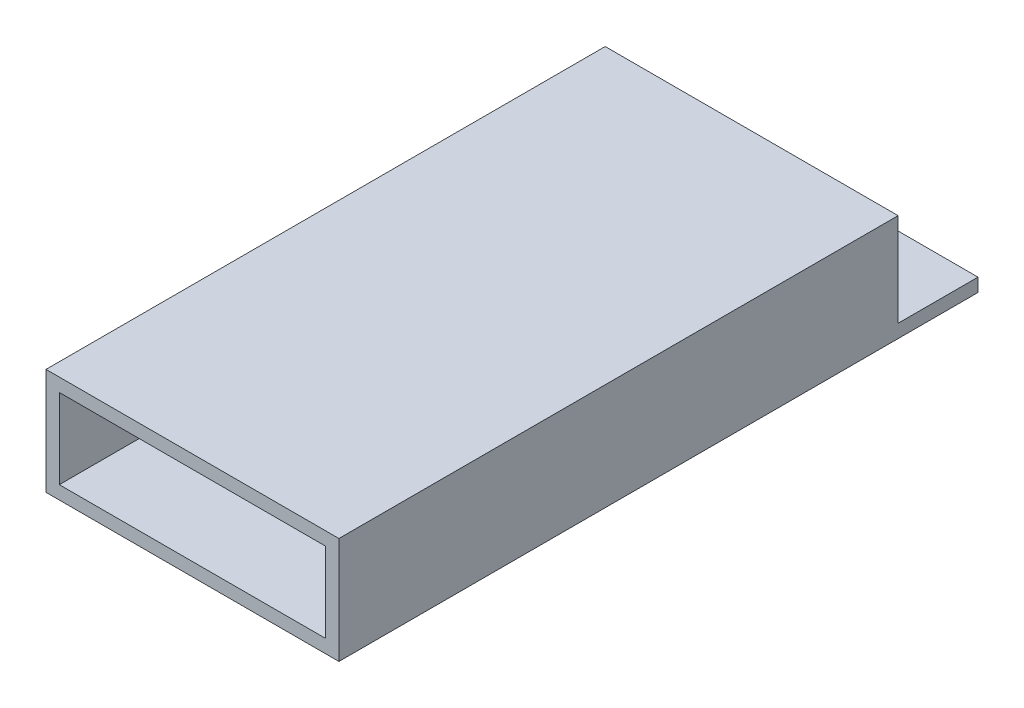
ISO-10303-21;
HEADER;
FILE_DESCRIPTION(('STEP AP214'),'2;1');
FILE_NAME('part.step','',(''),(''),'','','');
FILE_SCHEMA(('AUTOMOTIVE_DESIGN { 1 0 10303 214 1 1 1 1 }'));
ENDSEC;
DATA;
#1=APPLICATION_CONTEXT('core data for automotive mechanical design processes');
#2=APPLICATION_PROTOCOL_DEFINITION('international standard','automotive_design',2000,#1);
#3=PRODUCT_CONTEXT('',#1,'mechanical');
#4=PRODUCT('Part','Part','',(#3));
#5=PRODUCT_RELATED_PRODUCT_CATEGORY('part','',(#4));
#6=PRODUCT_DEFINITION_FORMATION('','',#4);
#7=PRODUCT_DEFINITION_CONTEXT('part definition',#1,'design');
#8=PRODUCT_DEFINITION('design','',#6,#7);
#9=PRODUCT_DEFINITION_SHAPE('','',#8);
#10=(LENGTH_UNIT() NAMED_UNIT(*) SI_UNIT(.MILLI.,.METRE.));
#11=(NAMED_UNIT(*) PLANE_ANGLE_UNIT() SI_UNIT($,.RADIAN.));
#12=(NAMED_UNIT(*) SI_UNIT($,.STERADIAN.) SOLID_ANGLE_UNIT());
#13=UNCERTAINTY_MEASURE_WITH_UNIT(LENGTH_MEASURE(1.E-05),#10,'distance_accuracy_value','');
#14=(GEOMETRIC_REPRESENTATION_CONTEXT(3) GLOBAL_UNCERTAINTY_ASSIGNED_CONTEXT((#13)) GLOBAL_UNIT_ASSIGNED_CONTEXT((#10,
#11,#12)) REPRESENTATION_CONTEXT('',''));
#15=CARTESIAN_POINT('',(0.,0.,0.));
#16=DIRECTION('',(0.,0.,1.));
#17=DIRECTION('',(1.,0.,0.));
#18=AXIS2_PLACEMENT_3D('',#15,#16,#17);
#19=CARTESIAN_POINT('',(0.,0.,420.));
#20=DIRECTION('',(0.,0.,-1.));
#21=DIRECTION('',(-1.,0.,0.));
#22=AXIS2_PLACEMENT_3D('',#19,#20,#21);
#23=PLANE('',#22);
#24=DIRECTION('',(0.,1.,0.));
#25=VECTOR('',#24,1.);
#26=CARTESIAN_POINT('',(110.,-40.,420.));
#27=LINE('',#26,#25);
#28=CARTESIAN_POINT('',(110.,-40.,420.));
#29=VERTEX_POINT('',#28);
#30=CARTESIAN_POINT('',(110.,40.,420.));
#31=VERTEX_POINT('',#30);
#32=EDGE_CURVE('E124',#29,#31,#27,.T.);
#33=ORIENTED_EDGE('',*,*,#32,.T.);
#34=DIRECTION('',(-1.,0.,0.));
#35=VECTOR('',#34,1.);
#36=CARTESIAN_POINT('',(-110.,40.,420.));
#37=LINE('',#36,#35);
#38=CARTESIAN_POINT('',(-110.,40.,420.));
#39=VERTEX_POINT('',#38);
#40=EDGE_CURVE('E178',#31,#39,#37,.T.);
#41=ORIENTED_EDGE('',*,*,#40,.T.);
#42=DIRECTION('',(0.,-1.,0.));
#43=VECTOR('',#42,1.);
#44=CARTESIAN_POINT('',(-110.,-40.,420.));
#45=LINE('',#44,#43);
#46=CARTESIAN_POINT('',(-110.,-40.,420.));
#47=VERTEX_POINT('',#46);
#48=EDGE_CURVE('E181',#39,#47,#45,.T.);
#49=ORIENTED_EDGE('',*,*,#48,.T.);
#50=DIRECTION('',(1.,0.,0.));
#51=VECTOR('',#50,1.);
#52=CARTESIAN_POINT('',(-110.,-40.,420.));
#53=LINE('',#52,#51);
#54=EDGE_CURVE('E128',#47,#29,#53,.T.);
#55=ORIENTED_EDGE('',*,*,#54,.T.);
#56=EDGE_LOOP('',(#33,#41,#49,#55));
#57=FACE_BOUND('',#56,.T.);
#58=DIRECTION('',(0.,1.,0.));
#59=VECTOR('',#58,1.);
#60=CARTESIAN_POINT('',(100.,-30.,420.));
#61=LINE('',#60,#59);
#62=CARTESIAN_POINT('',(100.,-30.,420.));
#63=VERTEX_POINT('',#62);
#64=CARTESIAN_POINT('',(100.,30.,420.));
#65=VERTEX_POINT('',#64);
#66=EDGE_CURVE('E152',#63,#65,#61,.T.);
#67=ORIENTED_EDGE('',*,*,#66,.F.);
#68=DIRECTION('',(1.,0.,0.));
#69=VECTOR('',#68,1.);
#70=CARTESIAN_POINT('',(-100.,-30.,420.));
#71=LINE('',#70,#69);
#72=CARTESIAN_POINT('',(-100.,-30.,420.));
#73=VERTEX_POINT('',#72);
#74=EDGE_CURVE('E159',#73,#63,#71,.T.);
#75=ORIENTED_EDGE('',*,*,#74,.F.);
#76=DIRECTION('',(0.,-1.,0.));
#77=VECTOR('',#76,1.);
#78=CARTESIAN_POINT('',(-100.,-30.,420.));
#79=LINE('',#78,#77);
#80=CARTESIAN_POINT('',(-100.,30.,420.));
#81=VERTEX_POINT('',#80);
#82=EDGE_CURVE('E157',#81,#73,#79,.T.);
#83=ORIENTED_EDGE('',*,*,#82,.F.);
#84=DIRECTION('',(-1.,0.,0.));
#85=VECTOR('',#84,1.);
#86=CARTESIAN_POINT('',(-100.,30.,420.));
#87=LINE('',#86,#85);
#88=EDGE_CURVE('E154',#65,#81,#87,.T.);
#89=ORIENTED_EDGE('',*,*,#88,.F.);
#90=EDGE_LOOP('',(#67,#75,#83,#89));
#91=FACE_BOUND('',#90,.T.);
#92=ADVANCED_FACE('F37',(#57,#91),#23,.F.);
#93=CARTESIAN_POINT('',(0.,0.,0.));
#94=DIRECTION('',(0.,0.,-1.));
#95=DIRECTION('',(-1.,0.,0.));
#96=AXIS2_PLACEMENT_3D('',#93,#94,#95);
#97=PLANE('',#96);
#98=DIRECTION('',(1.,0.,0.));
#99=VECTOR('',#98,1.);
#100=CARTESIAN_POINT('',(110.,-30.,0.));
#101=LINE('',#100,#99);
#102=CARTESIAN_POINT('',(-110.,-30.,0.));
#103=VERTEX_POINT('',#102);
#104=CARTESIAN_POINT('',(-100.,-30.,0.));
#105=VERTEX_POINT('',#104);
#106=EDGE_CURVE('E47',#103,#105,#101,.T.);
#107=ORIENTED_EDGE('',*,*,#106,.F.);
#108=DIRECTION('',(0.,-1.,0.));
#109=VECTOR('',#108,1.);
#110=CARTESIAN_POINT('',(-110.,-40.,0.));
#111=LINE('',#110,#109);
#112=CARTESIAN_POINT('',(-110.,40.,0.));
#113=VERTEX_POINT('',#112);
#114=EDGE_CURVE('E179',#113,#103,#111,.T.);
#115=ORIENTED_EDGE('',*,*,#114,.F.);
#116=DIRECTION('',(-1.,0.,0.));
#117=VECTOR('',#116,1.);
#118=CARTESIAN_POINT('',(-110.,40.,0.));
#119=LINE('',#118,#117);
#120=CARTESIAN_POINT('',(110.,40.,0.));
#121=VERTEX_POINT('',#120);
#122=EDGE_CURVE('E185',#121,#113,#119,.T.);
#123=ORIENTED_EDGE('',*,*,#122,.F.);
#124=DIRECTION('',(0.,1.,0.));
#125=VECTOR('',#124,1.);
#126=CARTESIAN_POINT('',(110.,-40.,0.));
#127=LINE('',#126,#125);
#128=CARTESIAN_POINT('',(110.,-30.,0.));
#129=VERTEX_POINT('',#128);
#130=EDGE_CURVE('E176',#129,#121,#127,.T.);
#131=ORIENTED_EDGE('',*,*,#130,.F.);
#132=CARTESIAN_POINT('',(100.,-30.,0.));
#133=VERTEX_POINT('',#132);
#134=EDGE_CURVE('E11',#133,#129,#101,.T.);
#135=ORIENTED_EDGE('',*,*,#134,.F.);
#136=DIRECTION('',(0.,1.,0.));
#137=VECTOR('',#136,1.);
#138=CARTESIAN_POINT('',(100.,-30.,0.));
#139=LINE('',#138,#137);
#140=CARTESIAN_POINT('',(100.,30.,0.));
#141=VERTEX_POINT('',#140);
#142=EDGE_CURVE('E151',#133,#141,#139,.T.);
#143=ORIENTED_EDGE('',*,*,#142,.T.);
#144=DIRECTION('',(-1.,0.,0.));
#145=VECTOR('',#144,1.);
#146=CARTESIAN_POINT('',(-100.,30.,0.));
#147=LINE('',#146,#145);
#148=CARTESIAN_POINT('',(-100.,30.,0.));
#149=VERTEX_POINT('',#148);
#150=EDGE_CURVE('E164',#141,#149,#147,.T.);
#151=ORIENTED_EDGE('',*,*,#150,.T.);
#152=DIRECTION('',(0.,-1.,0.));
#153=VECTOR('',#152,1.);
#154=CARTESIAN_POINT('',(-100.,-30.,0.));
#155=LINE('',#154,#153);
#156=EDGE_CURVE('E155',#149,#105,#155,.T.);
#157=ORIENTED_EDGE('',*,*,#156,.T.);
#158=EDGE_LOOP('',(#107,#115,#123,#131,#135,#143,#151,#157));
#159=FACE_BOUND('',#158,.T.);
#160=ADVANCED_FACE('F197',(#159),#97,.T.);
#161=CARTESIAN_POINT('',(110.,-40.,420.));
#162=DIRECTION('',(-1.,0.,0.));
#163=DIRECTION('',(0.,0.,1.));
#164=AXIS2_PLACEMENT_3D('',#161,#162,#163);
#165=PLANE('',#164);
#166=DIRECTION('',(0.,0.,-1.));
#167=VECTOR('',#166,1.);
#168=CARTESIAN_POINT('',(110.,-40.,420.));
#169=LINE('',#168,#167);
#170=CARTESIAN_POINT('',(110.,-40.,-60.));
#171=VERTEX_POINT('',#170);
#172=EDGE_CURVE('E117',#29,#171,#169,.T.);
#173=ORIENTED_EDGE('',*,*,#172,.T.);
#174=DIRECTION('',(0.,-1.,0.));
#175=VECTOR('',#174,1.);
#176=CARTESIAN_POINT('',(110.,-40.,-60.));
#177=LINE('',#176,#175);
#178=CARTESIAN_POINT('',(110.,-30.,-60.));
#179=VERTEX_POINT('',#178);
#180=EDGE_CURVE('E121',#179,#171,#177,.T.);
#181=ORIENTED_EDGE('',*,*,#180,.F.);
#182=DIRECTION('',(0.,0.,1.));
#183=VECTOR('',#182,1.);
#184=CARTESIAN_POINT('',(110.,-30.,-60.));
#185=LINE('',#184,#183);
#186=EDGE_CURVE('E145',#179,#129,#185,.T.);
#187=ORIENTED_EDGE('',*,*,#186,.T.);
#188=ORIENTED_EDGE('',*,*,#130,.T.);
#189=DIRECTION('',(0.,0.,-1.));
#190=VECTOR('',#189,1.);
#191=CARTESIAN_POINT('',(110.,40.,420.));
#192=LINE('',#191,#190);
#193=EDGE_CURVE('E41',#31,#121,#192,.T.);
#194=ORIENTED_EDGE('',*,*,#193,.F.);
#195=ORIENTED_EDGE('',*,*,#32,.F.);
#196=EDGE_LOOP('',(#173,#181,#187,#188,#194,#195));
#197=FACE_BOUND('',#196,.T.);
#198=ADVANCED_FACE('F39',(#197),#165,.F.);
#199=CARTESIAN_POINT('',(-110.,40.,420.));
#200=DIRECTION('',(0.,-1.,0.));
#201=DIRECTION('',(0.,0.,-1.));
#202=AXIS2_PLACEMENT_3D('',#199,#200,#201);
#203=PLANE('',#202);
#204=ORIENTED_EDGE('',*,*,#122,.T.);
#205=DIRECTION('',(0.,0.,-1.));
#206=VECTOR('',#205,1.);
#207=CARTESIAN_POINT('',(-110.,40.,420.));
#208=LINE('',#207,#206);
#209=EDGE_CURVE('E188',#39,#113,#208,.T.);
#210=ORIENTED_EDGE('',*,*,#209,.F.);
#211=ORIENTED_EDGE('',*,*,#40,.F.);
#212=ORIENTED_EDGE('',*,*,#193,.T.);
#213=EDGE_LOOP('',(#204,#210,#211,#212));
#214=FACE_BOUND('',#213,.T.);
#215=ADVANCED_FACE('F195',(#214),#203,.F.);
#216=CARTESIAN_POINT('',(-110.,-40.,420.));
#217=DIRECTION('',(1.,0.,0.));
#218=DIRECTION('',(0.,0.,-1.));
#219=AXIS2_PLACEMENT_3D('',#216,#217,#218);
#220=PLANE('',#219);
#221=ORIENTED_EDGE('',*,*,#114,.T.);
#222=DIRECTION('',(0.,0.,1.));
#223=VECTOR('',#222,1.);
#224=CARTESIAN_POINT('',(-110.,-30.,-60.));
#225=LINE('',#224,#223);
#226=CARTESIAN_POINT('',(-110.,-30.,-60.));
#227=VERTEX_POINT('',#226);
#228=EDGE_CURVE('E148',#227,#103,#225,.T.);
#229=ORIENTED_EDGE('',*,*,#228,.F.);
#230=DIRECTION('',(0.,1.,0.));
#231=VECTOR('',#230,1.);
#232=CARTESIAN_POINT('',(-110.,-40.,-60.));
#233=LINE('',#232,#231);
#234=CARTESIAN_POINT('',(-110.,-40.,-60.));
#235=VERTEX_POINT('',#234);
#236=EDGE_CURVE('E136',#235,#227,#233,.T.);
#237=ORIENTED_EDGE('',*,*,#236,.F.);
#238=DIRECTION('',(0.,0.,-1.));
#239=VECTOR('',#238,1.);
#240=CARTESIAN_POINT('',(-110.,-40.,420.));
#241=LINE('',#240,#239);
#242=EDGE_CURVE('E127',#47,#235,#241,.T.);
#243=ORIENTED_EDGE('',*,*,#242,.F.);
#244=ORIENTED_EDGE('',*,*,#48,.F.);
#245=ORIENTED_EDGE('',*,*,#209,.T.);
#246=EDGE_LOOP('',(#221,#229,#237,#243,#244,#245));
#247=FACE_BOUND('',#246,.T.);
#248=ADVANCED_FACE('F199',(#247),#220,.F.);
#249=CARTESIAN_POINT('',(-110.,-40.,420.));
#250=DIRECTION('',(0.,1.,0.));
#251=DIRECTION('',(0.,0.,1.));
#252=AXIS2_PLACEMENT_3D('',#249,#250,#251);
#253=PLANE('',#252);
#254=ORIENTED_EDGE('',*,*,#242,.T.);
#255=DIRECTION('',(-1.,0.,0.));
#256=VECTOR('',#255,1.);
#257=CARTESIAN_POINT('',(110.,-40.,-60.));
#258=LINE('',#257,#256);
#259=EDGE_CURVE('E131',#171,#235,#258,.T.);
#260=ORIENTED_EDGE('',*,*,#259,.F.);
#261=ORIENTED_EDGE('',*,*,#172,.F.);
#262=ORIENTED_EDGE('',*,*,#54,.F.);
#263=EDGE_LOOP('',(#254,#260,#261,#262));
#264=FACE_BOUND('',#263,.T.);
#265=ADVANCED_FACE('F132',(#264),#253,.F.);
#266=CARTESIAN_POINT('',(100.,-30.,420.));
#267=DIRECTION('',(-1.,0.,0.));
#268=DIRECTION('',(0.,0.,1.));
#269=AXIS2_PLACEMENT_3D('',#266,#267,#268);
#270=PLANE('',#269);
#271=ORIENTED_EDGE('',*,*,#142,.F.);
#272=DIRECTION('',(0.,0.,-1.));
#273=VECTOR('',#272,1.);
#274=CARTESIAN_POINT('',(100.,-30.,420.));
#275=LINE('',#274,#273);
#276=EDGE_CURVE('E161',#63,#133,#275,.T.);
#277=ORIENTED_EDGE('',*,*,#276,.F.);
#278=ORIENTED_EDGE('',*,*,#66,.T.);
#279=DIRECTION('',(0.,0.,-1.));
#280=VECTOR('',#279,1.);
#281=CARTESIAN_POINT('',(100.,30.,420.));
#282=LINE('',#281,#280);
#283=EDGE_CURVE('E173',#65,#141,#282,.T.);
#284=ORIENTED_EDGE('',*,*,#283,.T.);
#285=EDGE_LOOP('',(#271,#277,#278,#284));
#286=FACE_BOUND('',#285,.T.);
#287=ADVANCED_FACE('F204',(#286),#270,.T.);
#288=CARTESIAN_POINT('',(-100.,30.,420.));
#289=DIRECTION('',(0.,-1.,0.));
#290=DIRECTION('',(0.,0.,-1.));
#291=AXIS2_PLACEMENT_3D('',#288,#289,#290);
#292=PLANE('',#291);
#293=ORIENTED_EDGE('',*,*,#150,.F.);
#294=ORIENTED_EDGE('',*,*,#283,.F.);
#295=ORIENTED_EDGE('',*,*,#88,.T.);
#296=DIRECTION('',(0.,0.,-1.));
#297=VECTOR('',#296,1.);
#298=CARTESIAN_POINT('',(-100.,30.,420.));
#299=LINE('',#298,#297);
#300=EDGE_CURVE('E171',#81,#149,#299,.T.);
#301=ORIENTED_EDGE('',*,*,#300,.T.);
#302=EDGE_LOOP('',(#293,#294,#295,#301));
#303=FACE_BOUND('',#302,.T.);
#304=ADVANCED_FACE('F209',(#303),#292,.T.);
#305=CARTESIAN_POINT('',(-100.,-30.,420.));
#306=DIRECTION('',(1.,0.,0.));
#307=DIRECTION('',(0.,0.,-1.));
#308=AXIS2_PLACEMENT_3D('',#305,#306,#307);
#309=PLANE('',#308);
#310=ORIENTED_EDGE('',*,*,#156,.F.);
#311=ORIENTED_EDGE('',*,*,#300,.F.);
#312=ORIENTED_EDGE('',*,*,#82,.T.);
#313=DIRECTION('',(0.,0.,-1.));
#314=VECTOR('',#313,1.);
#315=CARTESIAN_POINT('',(-100.,-30.,420.));
#316=LINE('',#315,#314);
#317=EDGE_CURVE('E60',#73,#105,#316,.T.);
#318=ORIENTED_EDGE('',*,*,#317,.T.);
#319=EDGE_LOOP('',(#310,#311,#312,#318));
#320=FACE_BOUND('',#319,.T.);
#321=ADVANCED_FACE('F216',(#320),#309,.T.);
#322=CARTESIAN_POINT('',(-100.,-30.,420.));
#323=DIRECTION('',(0.,1.,0.));
#324=DIRECTION('',(0.,0.,1.));
#325=AXIS2_PLACEMENT_3D('',#322,#323,#324);
#326=PLANE('',#325);
#327=ORIENTED_EDGE('',*,*,#276,.T.);
#328=ORIENTED_EDGE('',*,*,#134,.T.);
#329=ORIENTED_EDGE('',*,*,#186,.F.);
#330=DIRECTION('',(1.,0.,0.));
#331=VECTOR('',#330,1.);
#332=CARTESIAN_POINT('',(110.,-30.,-60.));
#333=LINE('',#332,#331);
#334=EDGE_CURVE('E140',#227,#179,#333,.T.);
#335=ORIENTED_EDGE('',*,*,#334,.F.);
#336=ORIENTED_EDGE('',*,*,#228,.T.);
#337=ORIENTED_EDGE('',*,*,#106,.T.);
#338=ORIENTED_EDGE('',*,*,#317,.F.);
#339=ORIENTED_EDGE('',*,*,#74,.T.);
#340=EDGE_LOOP('',(#327,#328,#329,#335,#336,#337,#338,#339));
#341=FACE_BOUND('',#340,.T.);
#342=ADVANCED_FACE('F200',(#341),#326,.T.);
#343=CARTESIAN_POINT('',(0.,0.,-60.));
#344=DIRECTION('',(0.,0.,1.));
#345=DIRECTION('',(1.,0.,0.));
#346=AXIS2_PLACEMENT_3D('',#343,#344,#345);
#347=PLANE('',#346);
#348=ORIENTED_EDGE('',*,*,#180,.T.);
#349=ORIENTED_EDGE('',*,*,#259,.T.);
#350=ORIENTED_EDGE('',*,*,#236,.T.);
#351=ORIENTED_EDGE('',*,*,#334,.T.);
#352=EDGE_LOOP('',(#348,#349,#350,#351));
#353=FACE_BOUND('',#352,.T.);
#354=ADVANCED_FACE('F138',(#353),#347,.F.);
#355=CLOSED_SHELL('',(#92,#160,#198,#215,#248,#265,#287,#304,#321,#342,#354));
#356=MANIFOLD_SOLID_BREP('B2',#355);
#357=ADVANCED_BREP_SHAPE_REPRESENTATION('',(#18,#356),#14);
#358=SHAPE_DEFINITION_REPRESENTATION(#9,#357);
ENDSEC;
END-ISO-10303-21;
